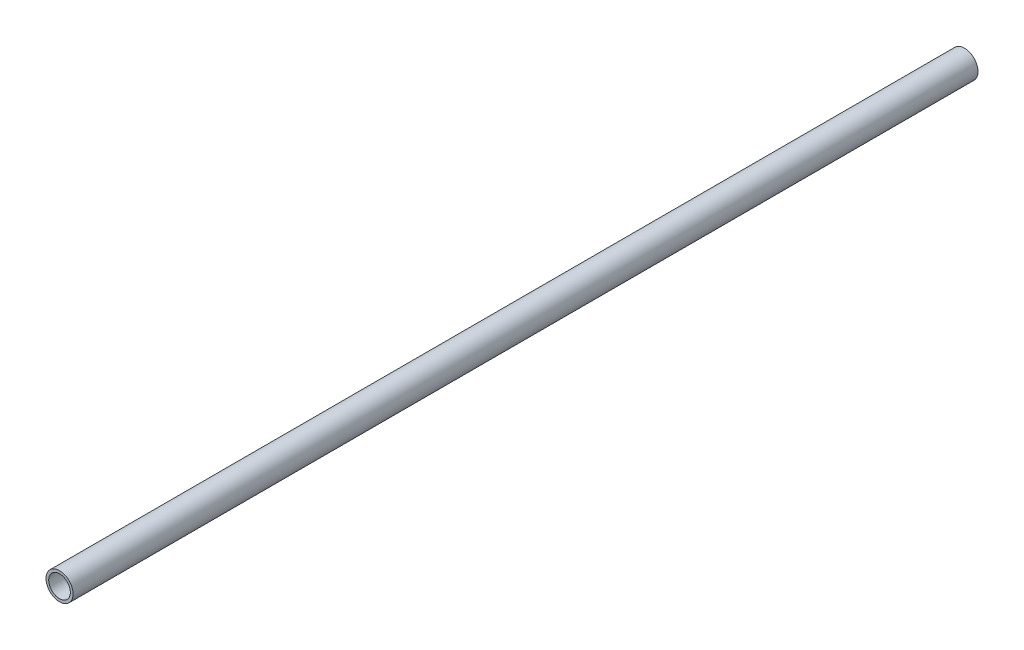
ISO-10303-21;
HEADER;
FILE_DESCRIPTION(('STEP AP214'),'2;1');
FILE_NAME('part.step','',(''),(''),'','','');
FILE_SCHEMA(('AUTOMOTIVE_DESIGN { 1 0 10303 214 1 1 1 1 }'));
ENDSEC;
DATA;
#1=APPLICATION_CONTEXT('core data for automotive mechanical design processes');
#2=APPLICATION_PROTOCOL_DEFINITION('international standard','automotive_design',2000,#1);
#3=PRODUCT_CONTEXT('',#1,'mechanical');
#4=PRODUCT('Part','Part','',(#3));
#5=PRODUCT_RELATED_PRODUCT_CATEGORY('part','',(#4));
#6=PRODUCT_DEFINITION_FORMATION('','',#4);
#7=PRODUCT_DEFINITION_CONTEXT('part definition',#1,'design');
#8=PRODUCT_DEFINITION('design','',#6,#7);
#9=PRODUCT_DEFINITION_SHAPE('','',#8);
#10=(LENGTH_UNIT() NAMED_UNIT(*) SI_UNIT(.MILLI.,.METRE.));
#11=(NAMED_UNIT(*) PLANE_ANGLE_UNIT() SI_UNIT($,.RADIAN.));
#12=(NAMED_UNIT(*) SI_UNIT($,.STERADIAN.) SOLID_ANGLE_UNIT());
#13=UNCERTAINTY_MEASURE_WITH_UNIT(LENGTH_MEASURE(1.E-05),#10,'distance_accuracy_value','');
#14=(GEOMETRIC_REPRESENTATION_CONTEXT(3) GLOBAL_UNCERTAINTY_ASSIGNED_CONTEXT((#13)) GLOBAL_UNIT_ASSIGNED_CONTEXT((#10,
#11,#12)) REPRESENTATION_CONTEXT('',''));
#15=CARTESIAN_POINT('',(0.,0.,0.));
#16=DIRECTION('',(0.,0.,1.));
#17=DIRECTION('',(1.,0.,0.));
#18=AXIS2_PLACEMENT_3D('',#15,#16,#17);
#19=CARTESIAN_POINT('',(16.0000000000005,15.9999999999993,105.254833995939));
#20=DIRECTION('',(0.,0.,-1.));
#21=DIRECTION('',(-1.,0.,0.));
#22=AXIS2_PLACEMENT_3D('',#19,#20,#21);
#23=CYLINDRICAL_SURFACE('',#22,16.);
#24=CARTESIAN_POINT('',(16.0000000000006,15.9999999999996,30.));
#25=DIRECTION('',(0.,0.,-1.));
#26=DIRECTION('',(-1.,0.,0.));
#27=AXIS2_PLACEMENT_3D('',#24,#25,#26);
#28=CIRCLE('',#27,16.);
#29=CARTESIAN_POINT('',(5.58580959264532E-13,15.9999999999996,30.));
#30=VERTEX_POINT('',#29);
#31=EDGE_CURVE('E54',#30,#30,#28,.T.);
#32=ORIENTED_EDGE('',*,*,#31,.T.);
#33=EDGE_LOOP('',(#32));
#34=FACE_BOUND('',#33,.T.);
#35=CARTESIAN_POINT('',(16.0000000000003,15.9999999999996,-1040.));
#36=DIRECTION('',(0.,0.,1.));
#37=DIRECTION('',(1.,0.,0.));
#38=AXIS2_PLACEMENT_3D('',#35,#36,#37);
#39=CIRCLE('',#38,16.);
#40=CARTESIAN_POINT('',(32.0000000000004,15.9999999999996,-1040.));
#41=VERTEX_POINT('',#40);
#42=EDGE_CURVE('E66',#41,#41,#39,.F.);
#43=ORIENTED_EDGE('',*,*,#42,.F.);
#44=EDGE_LOOP('',(#43));
#45=FACE_BOUND('',#44,.T.);
#46=ADVANCED_FACE('F46',(#34,#45),#23,.T.);
#47=CARTESIAN_POINT('',(16.0000000000005,15.9999999999993,105.254833995939));
#48=DIRECTION('',(0.,0.,-1.));
#49=DIRECTION('',(-1.,0.,0.));
#50=AXIS2_PLACEMENT_3D('',#47,#48,#49);
#51=CYLINDRICAL_SURFACE('',#50,12.8);
#52=CARTESIAN_POINT('',(16.0000000000006,15.9999999999996,30.));
#53=DIRECTION('',(0.,0.,-1.));
#54=DIRECTION('',(-1.,0.,0.));
#55=AXIS2_PLACEMENT_3D('',#52,#53,#54);
#56=CIRCLE('',#55,12.8);
#57=CARTESIAN_POINT('',(3.20000000000056,15.9999999999996,30.));
#58=VERTEX_POINT('',#57);
#59=EDGE_CURVE('E12',#58,#58,#56,.T.);
#60=ORIENTED_EDGE('',*,*,#59,.F.);
#61=EDGE_LOOP('',(#60));
#62=FACE_BOUND('',#61,.T.);
#63=CARTESIAN_POINT('',(16.0000000000003,15.9999999999996,-1040.));
#64=DIRECTION('',(0.,0.,1.));
#65=DIRECTION('',(1.,0.,0.));
#66=AXIS2_PLACEMENT_3D('',#63,#64,#65);
#67=CIRCLE('',#66,12.8);
#68=CARTESIAN_POINT('',(28.8000000000004,15.9999999999996,-1040.));
#69=VERTEX_POINT('',#68);
#70=EDGE_CURVE('E60',#69,#69,#67,.F.);
#71=ORIENTED_EDGE('',*,*,#70,.T.);
#72=EDGE_LOOP('',(#71));
#73=FACE_BOUND('',#72,.T.);
#74=ADVANCED_FACE('F78',(#62,#73),#51,.F.);
#75=CARTESIAN_POINT('',(1585.49459788995,-38.5000000000006,29.9999999999998));
#76=DIRECTION('',(0.,0.,-1.));
#77=DIRECTION('',(0.,1.,0.));
#78=AXIS2_PLACEMENT_3D('',#75,#76,#77);
#79=PLANE('',#78);
#80=ORIENTED_EDGE('',*,*,#59,.T.);
#81=EDGE_LOOP('',(#80));
#82=FACE_BOUND('',#81,.T.);
#83=ORIENTED_EDGE('',*,*,#31,.F.);
#84=EDGE_LOOP('',(#83));
#85=FACE_BOUND('',#84,.T.);
#86=ADVANCED_FACE('F48',(#82,#85),#79,.F.);
#87=CARTESIAN_POINT('',(1585.49459788995,-38.5000000000003,-1040.));
#88=DIRECTION('',(0.,0.,1.));
#89=DIRECTION('',(0.,-1.,0.));
#90=AXIS2_PLACEMENT_3D('',#87,#88,#89);
#91=PLANE('',#90);
#92=ORIENTED_EDGE('',*,*,#42,.T.);
#93=EDGE_LOOP('',(#92));
#94=FACE_BOUND('',#93,.T.);
#95=ORIENTED_EDGE('',*,*,#70,.F.);
#96=EDGE_LOOP('',(#95));
#97=FACE_BOUND('',#96,.T.);
#98=ADVANCED_FACE('F74',(#94,#97),#91,.F.);
#99=CLOSED_SHELL('',(#46,#74,#86,#98));
#100=MANIFOLD_SOLID_BREP('B2',#99);
#101=ADVANCED_BREP_SHAPE_REPRESENTATION('',(#18,#100),#14);
#102=SHAPE_DEFINITION_REPRESENTATION(#9,#101);
ENDSEC;
END-ISO-10303-21;
